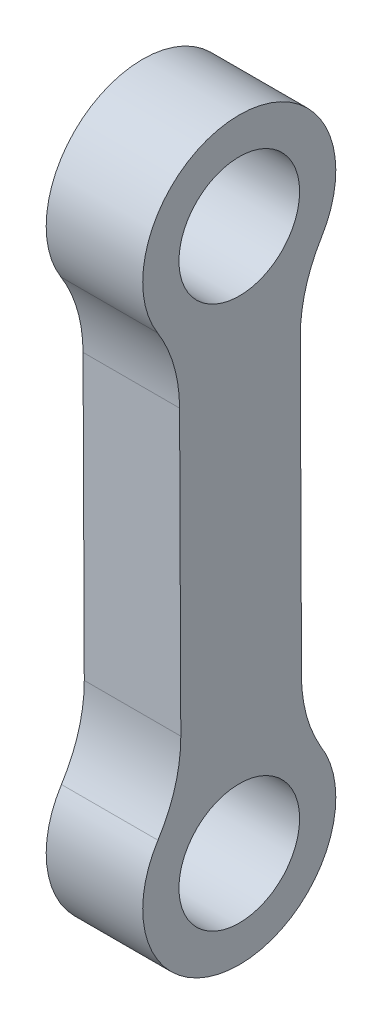
ISO-10303-21;
HEADER;
FILE_DESCRIPTION(('STEP AP214'),'2;1');
FILE_NAME('part.step','',(''),(''),'','','');
FILE_SCHEMA(('AUTOMOTIVE_DESIGN { 1 0 10303 214 1 1 1 1 }'));
ENDSEC;
DATA;
#1=APPLICATION_CONTEXT('core data for automotive mechanical design processes');
#2=APPLICATION_PROTOCOL_DEFINITION('international standard','automotive_design',2000,#1);
#3=PRODUCT_CONTEXT('',#1,'mechanical');
#4=PRODUCT('Part','Part','',(#3));
#5=PRODUCT_RELATED_PRODUCT_CATEGORY('part','',(#4));
#6=PRODUCT_DEFINITION_FORMATION('','',#4);
#7=PRODUCT_DEFINITION_CONTEXT('part definition',#1,'design');
#8=PRODUCT_DEFINITION('design','',#6,#7);
#9=PRODUCT_DEFINITION_SHAPE('','',#8);
#10=(LENGTH_UNIT() NAMED_UNIT(*) SI_UNIT(.MILLI.,.METRE.));
#11=(NAMED_UNIT(*) PLANE_ANGLE_UNIT() SI_UNIT($,.RADIAN.));
#12=(NAMED_UNIT(*) SI_UNIT($,.STERADIAN.) SOLID_ANGLE_UNIT());
#13=UNCERTAINTY_MEASURE_WITH_UNIT(LENGTH_MEASURE(1.E-05),#10,'distance_accuracy_value','');
#14=(GEOMETRIC_REPRESENTATION_CONTEXT(3) GLOBAL_UNCERTAINTY_ASSIGNED_CONTEXT((#13)) GLOBAL_UNIT_ASSIGNED_CONTEXT((#10,
#11,#12)) REPRESENTATION_CONTEXT('',''));
#15=CARTESIAN_POINT('',(0.,0.,0.));
#16=DIRECTION('',(0.,0.,1.));
#17=DIRECTION('',(1.,0.,0.));
#18=AXIS2_PLACEMENT_3D('',#15,#16,#17);
#19=CARTESIAN_POINT('',(-4.01,30.2151517721299,29.8415803815502));
#20=DIRECTION('',(0.,0.00428454068298778,-0.999990821313444));
#21=DIRECTION('',(0.,0.999990821313444,0.00428454068298778));
#22=AXIS2_PLACEMENT_3D('',#19,#20,#21);
#23=PLANE('',#22);
#24=DIRECTION('',(1.,0.,0.));
#25=VECTOR('',#24,1.);
#26=CARTESIAN_POINT('',(0.,30.225151680343,29.841623226957));
#27=LINE('',#26,#25);
#28=CARTESIAN_POINT('',(-4.,30.225151680343,29.841623226957));
#29=VERTEX_POINT('',#28);
#30=CARTESIAN_POINT('',(4.,30.2251516803431,29.841623226957));
#31=VERTEX_POINT('',#30);
#32=EDGE_CURVE('E101',#29,#31,#27,.T.);
#33=ORIENTED_EDGE('',*,*,#32,.F.);
#34=DIRECTION('',(0.,-0.999990821313444,-0.00428454068299005));
#35=VECTOR('',#34,1.);
#36=CARTESIAN_POINT('',(-4.,54.5009833803276,29.9456349701802));
#37=LINE('',#36,#35);
#38=CARTESIAN_POINT('',(-4.,54.5009833803276,29.9456349701802));
#39=VERTEX_POINT('',#38);
#40=EDGE_CURVE('E98',#39,#29,#37,.T.);
#41=ORIENTED_EDGE('',*,*,#40,.F.);
#42=DIRECTION('',(-1.,0.,0.));
#43=VECTOR('',#42,1.);
#44=CARTESIAN_POINT('',(0.,54.5009833803276,29.9456349701802));
#45=LINE('',#44,#43);
#46=CARTESIAN_POINT('',(4.,54.5009833803276,29.9456349701802));
#47=VERTEX_POINT('',#46);
#48=EDGE_CURVE('E167',#47,#39,#45,.T.);
#49=ORIENTED_EDGE('',*,*,#48,.F.);
#50=DIRECTION('',(0.,0.999990821313444,0.00428454068299005));
#51=VECTOR('',#50,1.);
#52=CARTESIAN_POINT('',(4.,30.2251516803431,29.841623226957));
#53=LINE('',#52,#51);
#54=EDGE_CURVE('E138',#31,#47,#53,.T.);
#55=ORIENTED_EDGE('',*,*,#54,.F.);
#56=EDGE_LOOP('',(#33,#41,#49,#55));
#57=FACE_BOUND('',#56,.T.);
#58=ADVANCED_FACE('F17',(#57),#23,.T.);
#59=CARTESIAN_POINT('',(-4.,54.5523978685234,17.9457451144189));
#60=DIRECTION('',(1.,0.,0.));
#61=DIRECTION('',(0.,0.,-1.));
#62=AXIS2_PLACEMENT_3D('',#59,#60,#61);
#63=CYLINDRICAL_SURFACE('',#62,12.);
#64=ORIENTED_EDGE('',*,*,#48,.T.);
#65=CARTESIAN_POINT('',(-4.,54.5523978685234,17.9457451144189));
#66=DIRECTION('',(1.,0.,0.));
#67=DIRECTION('',(0.,0.,-1.));
#68=AXIS2_PLACEMENT_3D('',#65,#66,#67);
#69=CIRCLE('',#68,12.);
#70=CARTESIAN_POINT('',(-4.,60.8209591474094,28.1782980457675));
#71=VERTEX_POINT('',#70);
#72=EDGE_CURVE('E150',#71,#39,#69,.T.);
#73=ORIENTED_EDGE('',*,*,#72,.F.);
#74=DIRECTION('',(-1.,0.,0.));
#75=VECTOR('',#74,1.);
#76=CARTESIAN_POINT('',(0.,60.8209591474094,28.1782980457675));
#77=LINE('',#76,#75);
#78=CARTESIAN_POINT('',(4.,60.8209591474094,28.1782980457675));
#79=VERTEX_POINT('',#78);
#80=EDGE_CURVE('E169',#79,#71,#77,.T.);
#81=ORIENTED_EDGE('',*,*,#80,.F.);
#82=CARTESIAN_POINT('',(4.,54.5523978685234,17.9457451144189));
#83=DIRECTION('',(1.,0.,0.));
#84=DIRECTION('',(0.,0.,-1.));
#85=AXIS2_PLACEMENT_3D('',#82,#83,#84);
#86=CIRCLE('',#85,12.);
#87=EDGE_CURVE('E135',#47,#79,#86,.F.);
#88=ORIENTED_EDGE('',*,*,#87,.F.);
#89=EDGE_LOOP('',(#64,#73,#81,#88));
#90=FACE_BOUND('',#89,.T.);
#91=ADVANCED_FACE('F191',(#90),#63,.F.);
#92=CARTESIAN_POINT('',(4.,64.9999999999999,34.9999999999999));
#93=DIRECTION('',(-1.,0.,0.));
#94=DIRECTION('',(0.,0.,1.));
#95=AXIS2_PLACEMENT_3D('',#92,#93,#94);
#96=CYLINDRICAL_SURFACE('',#95,7.99999999999994);
#97=ORIENTED_EDGE('',*,*,#80,.T.);
#98=CARTESIAN_POINT('',(-4.,64.9999999999999,34.9999999999999));
#99=DIRECTION('',(-1.,0.,0.));
#100=DIRECTION('',(0.,0.,1.));
#101=AXIS2_PLACEMENT_3D('',#98,#99,#100);
#102=CIRCLE('',#101,7.99999999999994);
#103=CARTESIAN_POINT('',(-4.,60.7506391334035,41.7781215853242));
#104=VERTEX_POINT('',#103);
#105=EDGE_CURVE('E152',#104,#71,#102,.T.);
#106=ORIENTED_EDGE('',*,*,#105,.F.);
#107=DIRECTION('',(-1.,0.,0.));
#108=VECTOR('',#107,1.);
#109=CARTESIAN_POINT('',(0.,60.7506391334035,41.7781215853242));
#110=LINE('',#109,#108);
#111=CARTESIAN_POINT('',(4.,60.7506391334035,41.7781215853242));
#112=VERTEX_POINT('',#111);
#113=EDGE_CURVE('E163',#112,#104,#110,.T.);
#114=ORIENTED_EDGE('',*,*,#113,.F.);
#115=CARTESIAN_POINT('',(4.,64.9999999999999,34.9999999999999));
#116=DIRECTION('',(-1.,0.,0.));
#117=DIRECTION('',(0.,0.,1.));
#118=AXIS2_PLACEMENT_3D('',#115,#116,#117);
#119=CIRCLE('',#118,7.99999999999994);
#120=EDGE_CURVE('E132',#79,#112,#119,.F.);
#121=ORIENTED_EDGE('',*,*,#120,.F.);
#122=EDGE_LOOP('',(#97,#106,#114,#121));
#123=FACE_BOUND('',#122,.T.);
#124=ADVANCED_FACE('F187',(#123),#96,.T.);
#125=CARTESIAN_POINT('',(-4.,54.3765978335088,51.9453039633103));
#126=DIRECTION('',(1.,0.,0.));
#127=DIRECTION('',(0.,0.,-1.));
#128=AXIS2_PLACEMENT_3D('',#125,#126,#127);
#129=CYLINDRICAL_SURFACE('',#128,11.9999999999998);
#130=ORIENTED_EDGE('',*,*,#113,.T.);
#131=CARTESIAN_POINT('',(-4.,54.3765978335088,51.9453039633103));
#132=DIRECTION('',(1.,0.,0.));
#133=DIRECTION('',(0.,0.,-1.));
#134=AXIS2_PLACEMENT_3D('',#131,#132,#133);
#135=CIRCLE('',#134,11.9999999999998);
#136=CARTESIAN_POINT('',(-4.,54.4280123217046,39.9454141075492));
#137=VERTEX_POINT('',#136);
#138=EDGE_CURVE('E155',#137,#104,#135,.T.);
#139=ORIENTED_EDGE('',*,*,#138,.F.);
#140=DIRECTION('',(-1.,0.,0.));
#141=VECTOR('',#140,1.);
#142=CARTESIAN_POINT('',(0.,54.4280123217045,39.9454141075492));
#143=LINE('',#142,#141);
#144=CARTESIAN_POINT('',(4.,54.4280123217046,39.9454141075492));
#145=VERTEX_POINT('',#144);
#146=EDGE_CURVE('E161',#145,#137,#143,.T.);
#147=ORIENTED_EDGE('',*,*,#146,.F.);
#148=CARTESIAN_POINT('',(4.,54.3765978335088,51.9453039633103));
#149=DIRECTION('',(1.,0.,0.));
#150=DIRECTION('',(0.,0.,-1.));
#151=AXIS2_PLACEMENT_3D('',#148,#149,#150);
#152=CIRCLE('',#151,11.9999999999998);
#153=EDGE_CURVE('E129',#112,#145,#152,.F.);
#154=ORIENTED_EDGE('',*,*,#153,.F.);
#155=EDGE_LOOP('',(#130,#139,#147,#154));
#156=FACE_BOUND('',#155,.T.);
#157=ADVANCED_FACE('F183',(#156),#129,.F.);
#158=CARTESIAN_POINT('',(-4.01,54.4380122299176,39.945456952956));
#159=DIRECTION('',(0.,-0.00428454068299146,0.999990821313444));
#160=DIRECTION('',(0.,-0.999990821313444,-0.00428454068299146));
#161=AXIS2_PLACEMENT_3D('',#158,#159,#160);
#162=PLANE('',#161);
#163=ORIENTED_EDGE('',*,*,#146,.T.);
#164=DIRECTION('',(0.,0.999990821313444,0.00428454068299261));
#165=VECTOR('',#164,1.);
#166=CARTESIAN_POINT('',(-4.,30.8343832466382,39.8443253160553));
#167=LINE('',#166,#165);
#168=CARTESIAN_POINT('',(-4.,30.8343832466383,39.8443253160553));
#169=VERTEX_POINT('',#168);
#170=EDGE_CURVE('E157',#169,#137,#167,.T.);
#171=ORIENTED_EDGE('',*,*,#170,.F.);
#172=DIRECTION('',(-1.,0.,0.));
#173=VECTOR('',#172,1.);
#174=CARTESIAN_POINT('',(0.,30.8343832466382,39.8443253160553));
#175=LINE('',#174,#173);
#176=CARTESIAN_POINT('',(4.,30.8343832466383,39.8443253160553));
#177=VERTEX_POINT('',#176);
#178=EDGE_CURVE('E160',#177,#169,#175,.T.);
#179=ORIENTED_EDGE('',*,*,#178,.F.);
#180=DIRECTION('',(0.,-0.999990821313444,-0.00428454068299261));
#181=VECTOR('',#180,1.);
#182=CARTESIAN_POINT('',(4.,54.4280123217045,39.9454141075492));
#183=LINE('',#182,#181);
#184=EDGE_CURVE('E126',#145,#177,#183,.T.);
#185=ORIENTED_EDGE('',*,*,#184,.F.);
#186=EDGE_LOOP('',(#163,#171,#179,#185));
#187=FACE_BOUND('',#186,.T.);
#188=ADVANCED_FACE('F180',(#187),#162,.T.);
#189=CARTESIAN_POINT('',(-4.,20.,35.));
#190=DIRECTION('',(1.,0.,0.));
#191=DIRECTION('',(0.,0.,-1.));
#192=AXIS2_PLACEMENT_3D('',#189,#190,#191);
#193=CYLINDRICAL_SURFACE('',#192,5.);
#194=CARTESIAN_POINT('',(-4.,20.,35.));
#195=DIRECTION('',(1.,0.,0.));
#196=DIRECTION('',(0.,0.,-1.));
#197=AXIS2_PLACEMENT_3D('',#194,#195,#196);
#198=CIRCLE('',#197,5.);
#199=CARTESIAN_POINT('',(-4.,20.,30.));
#200=VERTEX_POINT('',#199);
#201=EDGE_CURVE('E146',#200,#200,#198,.T.);
#202=ORIENTED_EDGE('',*,*,#201,.F.);
#203=EDGE_LOOP('',(#202));
#204=FACE_BOUND('',#203,.T.);
#205=CARTESIAN_POINT('',(4.,20.,35.));
#206=DIRECTION('',(1.,0.,0.));
#207=DIRECTION('',(0.,0.,-1.));
#208=AXIS2_PLACEMENT_3D('',#205,#206,#207);
#209=CIRCLE('',#208,5.);
#210=CARTESIAN_POINT('',(4.,20.,30.));
#211=VERTEX_POINT('',#210);
#212=EDGE_CURVE('E123',#211,#211,#209,.F.);
#213=ORIENTED_EDGE('',*,*,#212,.F.);
#214=EDGE_LOOP('',(#213));
#215=FACE_BOUND('',#214,.T.);
#216=ADVANCED_FACE('F221',(#204,#215),#193,.F.);
#217=CARTESIAN_POINT('',(-4.,65.,35.));
#218=DIRECTION('',(1.,0.,0.));
#219=DIRECTION('',(0.,0.,-1.));
#220=AXIS2_PLACEMENT_3D('',#217,#218,#219);
#221=CYLINDRICAL_SURFACE('',#220,5.);
#222=CARTESIAN_POINT('',(-4.,65.,35.));
#223=DIRECTION('',(1.,0.,0.));
#224=DIRECTION('',(0.,0.,-1.));
#225=AXIS2_PLACEMENT_3D('',#222,#223,#224);
#226=CIRCLE('',#225,5.);
#227=CARTESIAN_POINT('',(-4.,65.,30.));
#228=VERTEX_POINT('',#227);
#229=EDGE_CURVE('E102',#228,#228,#226,.T.);
#230=ORIENTED_EDGE('',*,*,#229,.F.);
#231=EDGE_LOOP('',(#230));
#232=FACE_BOUND('',#231,.T.);
#233=CARTESIAN_POINT('',(4.,65.,35.));
#234=DIRECTION('',(1.,0.,0.));
#235=DIRECTION('',(0.,0.,-1.));
#236=AXIS2_PLACEMENT_3D('',#233,#234,#235);
#237=CIRCLE('',#236,5.);
#238=CARTESIAN_POINT('',(4.,65.,30.));
#239=VERTEX_POINT('',#238);
#240=EDGE_CURVE('E120',#239,#239,#237,.F.);
#241=ORIENTED_EDGE('',*,*,#240,.F.);
#242=EDGE_LOOP('',(#241));
#243=FACE_BOUND('',#242,.T.);
#244=ADVANCED_FACE('F218',(#232,#243),#221,.F.);
#245=CARTESIAN_POINT('',(-4.,30.7829687584425,51.8442151718173));
#246=DIRECTION('',(1.,0.,0.));
#247=DIRECTION('',(0.,0.,-1.));
#248=AXIS2_PLACEMENT_3D('',#245,#246,#247);
#249=CYLINDRICAL_SURFACE('',#248,12.0000000000006);
#250=ORIENTED_EDGE('',*,*,#178,.T.);
#251=CARTESIAN_POINT('',(-4.,30.7829687584425,51.8442151718173));
#252=DIRECTION('',(1.,0.,0.));
#253=DIRECTION('',(0.,0.,-1.));
#254=AXIS2_PLACEMENT_3D('',#251,#252,#253);
#255=CIRCLE('',#254,12.0000000000006);
#256=CARTESIAN_POINT('',(-4.,24.3131875033769,41.7376860687267));
#257=VERTEX_POINT('',#256);
#258=EDGE_CURVE('E21',#257,#169,#255,.T.);
#259=ORIENTED_EDGE('',*,*,#258,.F.);
#260=DIRECTION('',(-1.,0.,0.));
#261=VECTOR('',#260,1.);
#262=CARTESIAN_POINT('',(0.,24.3131875033769,41.7376860687267));
#263=LINE('',#262,#261);
#264=CARTESIAN_POINT('',(4.,24.3131875033769,41.7376860687267));
#265=VERTEX_POINT('',#264);
#266=EDGE_CURVE('E114',#265,#257,#263,.T.);
#267=ORIENTED_EDGE('',*,*,#266,.F.);
#268=CARTESIAN_POINT('',(4.,30.7829687584425,51.8442151718173));
#269=DIRECTION('',(1.,0.,0.));
#270=DIRECTION('',(0.,0.,-1.));
#271=AXIS2_PLACEMENT_3D('',#268,#269,#270);
#272=CIRCLE('',#271,12.0000000000006);
#273=EDGE_CURVE('E142',#177,#265,#272,.F.);
#274=ORIENTED_EDGE('',*,*,#273,.F.);
#275=EDGE_LOOP('',(#250,#259,#267,#274));
#276=FACE_BOUND('',#275,.T.);
#277=ADVANCED_FACE('F175',(#276),#249,.F.);
#278=CARTESIAN_POINT('',(-4.,75.5456623887168,24.5193761692501));
#279=DIRECTION('',(-1.,0.,0.));
#280=DIRECTION('',(0.,-1.,0.));
#281=AXIS2_PLACEMENT_3D('',#278,#279,#280);
#282=PLANE('',#281);
#283=ORIENTED_EDGE('',*,*,#229,.T.);
#284=EDGE_LOOP('',(#283));
#285=FACE_BOUND('',#284,.T.);
#286=ORIENTED_EDGE('',*,*,#201,.T.);
#287=EDGE_LOOP('',(#286));
#288=FACE_BOUND('',#287,.T.);
#289=CARTESIAN_POINT('',(-4.,30.2480288802923,17.9905275363174));
#290=DIRECTION('',(1.,0.,0.));
#291=DIRECTION('',(0.,0.,-1.));
#292=AXIS2_PLACEMENT_3D('',#289,#290,#291);
#293=CIRCLE('',#292,11.863049493316);
#294=CARTESIAN_POINT('',(-4.,24.3131898213527,28.2623155318586));
#295=VERTEX_POINT('',#294);
#296=CARTESIAN_POINT('',(-4.,30.2210650000549,29.8535463860886));
#297=VERTEX_POINT('',#296);
#298=EDGE_CURVE('E90',#295,#297,#293,.F.);
#299=ORIENTED_EDGE('',*,*,#298,.F.);
#300=CARTESIAN_POINT('',(-4.,20.,35.));
#301=DIRECTION('',(-1.,0.,0.));
#302=DIRECTION('',(0.,0.,1.));
#303=AXIS2_PLACEMENT_3D('',#300,#301,#302);
#304=CIRCLE('',#303,8.00000000000002);
#305=EDGE_CURVE('E112',#257,#295,#304,.F.);
#306=ORIENTED_EDGE('',*,*,#305,.F.);
#307=ORIENTED_EDGE('',*,*,#258,.T.);
#308=ORIENTED_EDGE('',*,*,#170,.T.);
#309=ORIENTED_EDGE('',*,*,#138,.T.);
#310=ORIENTED_EDGE('',*,*,#105,.T.);
#311=ORIENTED_EDGE('',*,*,#72,.T.);
#312=ORIENTED_EDGE('',*,*,#40,.T.);
#313=DIRECTION('',(0.,0.324261270555491,-0.945967562032514));
#314=VECTOR('',#313,1.);
#315=CARTESIAN_POINT('',(-4.,30.2231081544282,29.8475848061005));
#316=LINE('',#315,#314);
#317=EDGE_CURVE('E93',#297,#29,#316,.T.);
#318=ORIENTED_EDGE('',*,*,#317,.F.);
#319=EDGE_LOOP('',(#299,#306,#307,#308,#309,#310,#311,#312,#318));
#320=FACE_BOUND('',#319,.T.);
#321=ADVANCED_FACE('F95',(#285,#288,#320),#282,.T.);
#322=CARTESIAN_POINT('',(-4.01,30.2206559233304,29.8547387010728));
#323=DIRECTION('',(0.,-0.945967562032514,-0.324261270555491));
#324=DIRECTION('',(0.,0.324261270555491,-0.945967562032514));
#325=AXIS2_PLACEMENT_3D('',#322,#323,#324);
#326=PLANE('',#325);
#327=ORIENTED_EDGE('',*,*,#32,.T.);
#328=DIRECTION('',(0.,0.324261270563316,-0.945967562029832));
#329=VECTOR('',#328,1.);
#330=CARTESIAN_POINT('',(4.,30.221064706127,29.8535461588217));
#331=LINE('',#330,#329);
#332=CARTESIAN_POINT('',(4.,30.2210650000549,29.8535463860886));
#333=VERTEX_POINT('',#332);
#334=EDGE_CURVE('E108',#333,#31,#331,.T.);
#335=ORIENTED_EDGE('',*,*,#334,.F.);
#336=DIRECTION('',(1.,0.,0.));
#337=VECTOR('',#336,1.);
#338=CARTESIAN_POINT('',(0.,30.2210653715964,29.8535463869331));
#339=LINE('',#338,#337);
#340=EDGE_CURVE('E105',#297,#333,#339,.T.);
#341=ORIENTED_EDGE('',*,*,#340,.F.);
#342=ORIENTED_EDGE('',*,*,#317,.T.);
#343=EDGE_LOOP('',(#327,#335,#341,#342));
#344=FACE_BOUND('',#343,.T.);
#345=ADVANCED_FACE('F106',(#344),#326,.T.);
#346=CARTESIAN_POINT('',(4.,9.40989905613463,24.5193761692501));
#347=DIRECTION('',(1.,0.,0.));
#348=DIRECTION('',(0.,1.,0.));
#349=AXIS2_PLACEMENT_3D('',#346,#347,#348);
#350=PLANE('',#349);
#351=ORIENTED_EDGE('',*,*,#240,.T.);
#352=EDGE_LOOP('',(#351));
#353=FACE_BOUND('',#352,.T.);
#354=ORIENTED_EDGE('',*,*,#212,.T.);
#355=EDGE_LOOP('',(#354));
#356=FACE_BOUND('',#355,.T.);
#357=ORIENTED_EDGE('',*,*,#153,.T.);
#358=ORIENTED_EDGE('',*,*,#184,.T.);
#359=ORIENTED_EDGE('',*,*,#273,.T.);
#360=CARTESIAN_POINT('',(4.,20.,35.));
#361=DIRECTION('',(-1.,0.,0.));
#362=DIRECTION('',(0.,0.,1.));
#363=AXIS2_PLACEMENT_3D('',#360,#361,#362);
#364=CIRCLE('',#363,8.00000000000002);
#365=CARTESIAN_POINT('',(4.,24.3131898213526,28.2623155318586));
#366=VERTEX_POINT('',#365);
#367=EDGE_CURVE('E36',#366,#265,#364,.T.);
#368=ORIENTED_EDGE('',*,*,#367,.F.);
#369=CARTESIAN_POINT('',(4.,30.2480288802923,17.9905275363174));
#370=DIRECTION('',(1.,0.,0.));
#371=DIRECTION('',(0.,0.,-1.));
#372=AXIS2_PLACEMENT_3D('',#369,#370,#371);
#373=CIRCLE('',#372,11.863049493316);
#374=EDGE_CURVE('E27',#333,#366,#373,.T.);
#375=ORIENTED_EDGE('',*,*,#374,.F.);
#376=ORIENTED_EDGE('',*,*,#334,.T.);
#377=ORIENTED_EDGE('',*,*,#54,.T.);
#378=ORIENTED_EDGE('',*,*,#87,.T.);
#379=ORIENTED_EDGE('',*,*,#120,.T.);
#380=EDGE_LOOP('',(#357,#358,#359,#368,#375,#376,#377,#378,#379));
#381=FACE_BOUND('',#380,.T.);
#382=ADVANCED_FACE('F177',(#353,#356,#381),#350,.T.);
#383=CARTESIAN_POINT('',(4.,20.,35.));
#384=DIRECTION('',(-1.,0.,0.));
#385=DIRECTION('',(0.,0.,1.));
#386=AXIS2_PLACEMENT_3D('',#383,#384,#385);
#387=CYLINDRICAL_SURFACE('',#386,8.00000000000002);
#388=ORIENTED_EDGE('',*,*,#266,.T.);
#389=ORIENTED_EDGE('',*,*,#305,.T.);
#390=DIRECTION('',(-1.,0.,0.));
#391=VECTOR('',#390,1.);
#392=CARTESIAN_POINT('',(0.,24.3131879503201,28.2623144508124));
#393=LINE('',#392,#391);
#394=EDGE_CURVE('E11',#366,#295,#393,.T.);
#395=ORIENTED_EDGE('',*,*,#394,.F.);
#396=ORIENTED_EDGE('',*,*,#367,.T.);
#397=EDGE_LOOP('',(#388,#389,#395,#396));
#398=FACE_BOUND('',#397,.T.);
#399=ADVANCED_FACE('F174',(#398),#387,.T.);
#400=CARTESIAN_POINT('',(-4.,30.2480288802923,17.9905275363174));
#401=DIRECTION('',(1.,0.,0.));
#402=DIRECTION('',(0.,0.,-1.));
#403=AXIS2_PLACEMENT_3D('',#400,#401,#402);
#404=CYLINDRICAL_SURFACE('',#403,11.863049493316);
#405=ORIENTED_EDGE('',*,*,#374,.T.);
#406=ORIENTED_EDGE('',*,*,#394,.T.);
#407=ORIENTED_EDGE('',*,*,#298,.T.);
#408=ORIENTED_EDGE('',*,*,#340,.T.);
#409=EDGE_LOOP('',(#405,#406,#407,#408));
#410=FACE_BOUND('',#409,.T.);
#411=ADVANCED_FACE('F19',(#410),#404,.F.);
#412=CLOSED_SHELL('',(#58,#91,#124,#157,#188,#216,#244,#277,#321,#345,#382,#399,#411));
#413=MANIFOLD_SOLID_BREP('B1',#412);
#414=ADVANCED_BREP_SHAPE_REPRESENTATION('',(#18,#413),#14);
#415=SHAPE_DEFINITION_REPRESENTATION(#9,#414);
ENDSEC;
END-ISO-10303-21;
